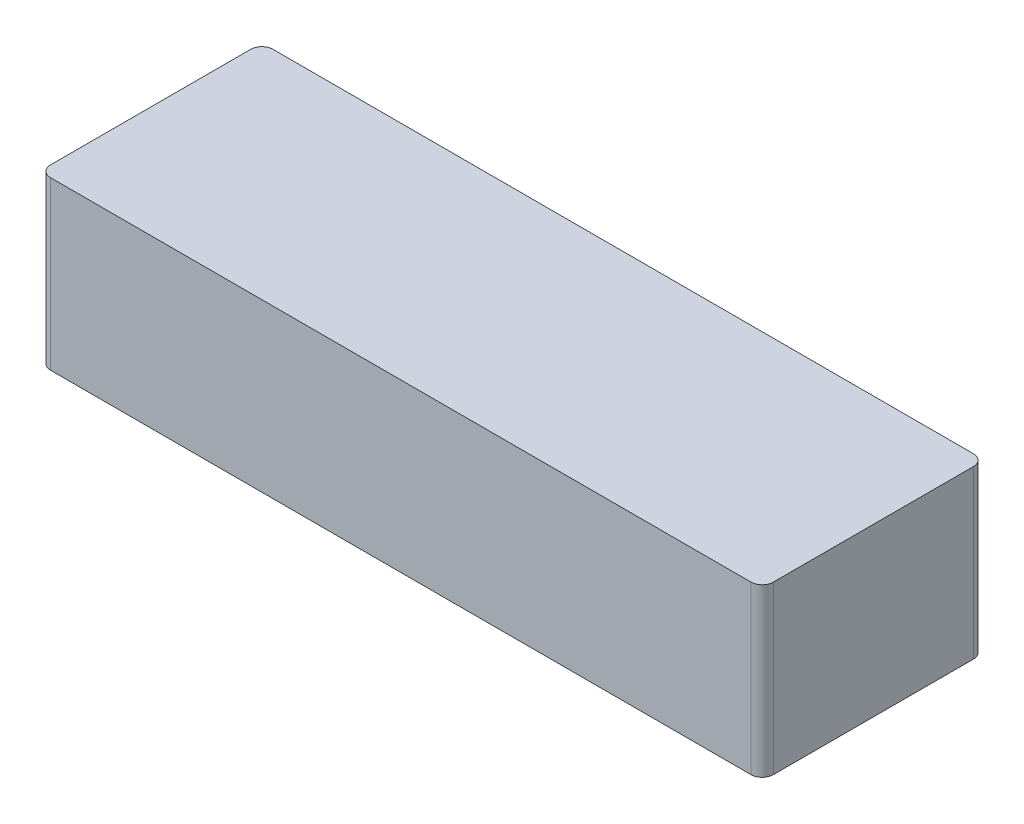
ISO-10303-21;
HEADER;
FILE_DESCRIPTION(('STEP AP214'),'2;1');
FILE_NAME('part.step','',(''),(''),'','','');
FILE_SCHEMA(('AUTOMOTIVE_DESIGN { 1 0 10303 214 1 1 1 1 }'));
ENDSEC;
DATA;
#1=APPLICATION_CONTEXT('core data for automotive mechanical design processes');
#2=APPLICATION_PROTOCOL_DEFINITION('international standard','automotive_design',2000,#1);
#3=PRODUCT_CONTEXT('',#1,'mechanical');
#4=PRODUCT('Part','Part','',(#3));
#5=PRODUCT_RELATED_PRODUCT_CATEGORY('part','',(#4));
#6=PRODUCT_DEFINITION_FORMATION('','',#4);
#7=PRODUCT_DEFINITION_CONTEXT('part definition',#1,'design');
#8=PRODUCT_DEFINITION('design','',#6,#7);
#9=PRODUCT_DEFINITION_SHAPE('','',#8);
#10=(LENGTH_UNIT() NAMED_UNIT(*) SI_UNIT(.MILLI.,.METRE.));
#11=(NAMED_UNIT(*) PLANE_ANGLE_UNIT() SI_UNIT($,.RADIAN.));
#12=(NAMED_UNIT(*) SI_UNIT($,.STERADIAN.) SOLID_ANGLE_UNIT());
#13=UNCERTAINTY_MEASURE_WITH_UNIT(LENGTH_MEASURE(1.E-05),#10,'distance_accuracy_value','');
#14=(GEOMETRIC_REPRESENTATION_CONTEXT(3) GLOBAL_UNCERTAINTY_ASSIGNED_CONTEXT((#13)) GLOBAL_UNIT_ASSIGNED_CONTEXT((#10,
#11,#12)) REPRESENTATION_CONTEXT('',''));
#15=CARTESIAN_POINT('',(0.,0.,0.));
#16=DIRECTION('',(0.,0.,1.));
#17=DIRECTION('',(1.,0.,0.));
#18=AXIS2_PLACEMENT_3D('',#15,#16,#17);
#19=CARTESIAN_POINT('',(64.9999999999999,-15.,40.));
#20=DIRECTION('',(-1.,0.,0.));
#21=DIRECTION('',(0.,0.,1.));
#22=AXIS2_PLACEMENT_3D('',#19,#20,#21);
#23=PLANE('',#22);
#24=DIRECTION('',(0.,0.,-1.));
#25=VECTOR('',#24,1.);
#26=CARTESIAN_POINT('',(64.9999999999999,-15.,40.));
#27=LINE('',#26,#25);
#28=CARTESIAN_POINT('',(64.9999999999999,-15.,38.));
#29=VERTEX_POINT('',#28);
#30=CARTESIAN_POINT('',(64.9999999999999,-15.,2.));
#31=VERTEX_POINT('',#30);
#32=EDGE_CURVE('E179',#29,#31,#27,.T.);
#33=ORIENTED_EDGE('',*,*,#32,.T.);
#34=DIRECTION('',(0.,1.,0.));
#35=VECTOR('',#34,1.);
#36=CARTESIAN_POINT('',(64.9999999999999,15.,2.));
#37=LINE('',#36,#35);
#38=CARTESIAN_POINT('',(64.9999999999999,15.,2.));
#39=VERTEX_POINT('',#38);
#40=EDGE_CURVE('E125',#31,#39,#37,.T.);
#41=ORIENTED_EDGE('',*,*,#40,.T.);
#42=DIRECTION('',(0.,0.,-1.));
#43=VECTOR('',#42,1.);
#44=CARTESIAN_POINT('',(64.9999999999999,15.,40.));
#45=LINE('',#44,#43);
#46=CARTESIAN_POINT('',(64.9999999999999,15.,38.));
#47=VERTEX_POINT('',#46);
#48=EDGE_CURVE('E116',#47,#39,#45,.T.);
#49=ORIENTED_EDGE('',*,*,#48,.F.);
#50=DIRECTION('',(0.,1.,0.));
#51=VECTOR('',#50,1.);
#52=CARTESIAN_POINT('',(64.9999999999999,-15.,38.));
#53=LINE('',#52,#51);
#54=EDGE_CURVE('E130',#47,#29,#53,.F.);
#55=ORIENTED_EDGE('',*,*,#54,.T.);
#56=EDGE_LOOP('',(#33,#41,#49,#55));
#57=FACE_BOUND('',#56,.T.);
#58=ADVANCED_FACE('F45',(#57),#23,.F.);
#59=CARTESIAN_POINT('',(-65.0000000000001,15.,40.));
#60=DIRECTION('',(0.,-1.,0.));
#61=DIRECTION('',(0.,0.,-1.));
#62=AXIS2_PLACEMENT_3D('',#59,#60,#61);
#63=PLANE('',#62);
#64=ORIENTED_EDGE('',*,*,#48,.T.);
#65=CARTESIAN_POINT('',(62.9999999999999,15.,2.));
#66=DIRECTION('',(0.,-1.,0.));
#67=DIRECTION('',(0.,0.,-1.));
#68=AXIS2_PLACEMENT_3D('',#65,#66,#67);
#69=CIRCLE('',#68,2.);
#70=CARTESIAN_POINT('',(62.9999999999999,15.,0.));
#71=VERTEX_POINT('',#70);
#72=EDGE_CURVE('E149',#39,#71,#69,.F.);
#73=ORIENTED_EDGE('',*,*,#72,.T.);
#74=DIRECTION('',(-1.,0.,0.));
#75=VECTOR('',#74,1.);
#76=CARTESIAN_POINT('',(-65.0000000000001,15.,0.));
#77=LINE('',#76,#75);
#78=CARTESIAN_POINT('',(-63.0000000000001,15.,0.));
#79=VERTEX_POINT('',#78);
#80=EDGE_CURVE('E188',#71,#79,#77,.T.);
#81=ORIENTED_EDGE('',*,*,#80,.T.);
#82=CARTESIAN_POINT('',(-63.0000000000001,15.,2.));
#83=DIRECTION('',(0.,-1.,0.));
#84=DIRECTION('',(0.,0.,-1.));
#85=AXIS2_PLACEMENT_3D('',#82,#83,#84);
#86=CIRCLE('',#85,2.);
#87=CARTESIAN_POINT('',(-65.0000000000001,15.,2.));
#88=VERTEX_POINT('',#87);
#89=EDGE_CURVE('E146',#79,#88,#86,.F.);
#90=ORIENTED_EDGE('',*,*,#89,.T.);
#91=DIRECTION('',(0.,0.,-1.));
#92=VECTOR('',#91,1.);
#93=CARTESIAN_POINT('',(-65.0000000000001,15.,40.));
#94=LINE('',#93,#92);
#95=CARTESIAN_POINT('',(-65.0000000000001,15.,38.));
#96=VERTEX_POINT('',#95);
#97=EDGE_CURVE('E134',#96,#88,#94,.T.);
#98=ORIENTED_EDGE('',*,*,#97,.F.);
#99=CARTESIAN_POINT('',(-63.0000000000001,15.,38.));
#100=DIRECTION('',(0.,-1.,0.));
#101=DIRECTION('',(0.,0.,-1.));
#102=AXIS2_PLACEMENT_3D('',#99,#100,#101);
#103=CIRCLE('',#102,2.);
#104=CARTESIAN_POINT('',(-63.0000000000001,15.,40.));
#105=VERTEX_POINT('',#104);
#106=EDGE_CURVE('E124',#96,#105,#103,.F.);
#107=ORIENTED_EDGE('',*,*,#106,.T.);
#108=DIRECTION('',(-1.,0.,0.));
#109=VECTOR('',#108,1.);
#110=CARTESIAN_POINT('',(-65.0000000000001,15.,40.));
#111=LINE('',#110,#109);
#112=CARTESIAN_POINT('',(62.9999999999999,15.,40.));
#113=VERTEX_POINT('',#112);
#114=EDGE_CURVE('E118',#113,#105,#111,.T.);
#115=ORIENTED_EDGE('',*,*,#114,.F.);
#116=CARTESIAN_POINT('',(62.9999999999999,15.,38.));
#117=DIRECTION('',(0.,-1.,0.));
#118=DIRECTION('',(0.,0.,-1.));
#119=AXIS2_PLACEMENT_3D('',#116,#117,#118);
#120=CIRCLE('',#119,2.);
#121=EDGE_CURVE('E113',#113,#47,#120,.F.);
#122=ORIENTED_EDGE('',*,*,#121,.T.);
#123=EDGE_LOOP('',(#64,#73,#81,#90,#98,#107,#115,#122));
#124=FACE_BOUND('',#123,.T.);
#125=ADVANCED_FACE('F115',(#124),#63,.F.);
#126=CARTESIAN_POINT('',(-65.0000000000001,-15.,40.));
#127=DIRECTION('',(1.,0.,0.));
#128=DIRECTION('',(0.,0.,-1.));
#129=AXIS2_PLACEMENT_3D('',#126,#127,#128);
#130=PLANE('',#129);
#131=ORIENTED_EDGE('',*,*,#97,.T.);
#132=DIRECTION('',(0.,-1.,0.));
#133=VECTOR('',#132,1.);
#134=CARTESIAN_POINT('',(-65.0000000000001,-15.,2.));
#135=LINE('',#134,#133);
#136=CARTESIAN_POINT('',(-65.0000000000001,-15.,2.));
#137=VERTEX_POINT('',#136);
#138=EDGE_CURVE('E170',#88,#137,#135,.T.);
#139=ORIENTED_EDGE('',*,*,#138,.T.);
#140=DIRECTION('',(0.,0.,-1.));
#141=VECTOR('',#140,1.);
#142=CARTESIAN_POINT('',(-65.0000000000001,-15.,40.));
#143=LINE('',#142,#141);
#144=CARTESIAN_POINT('',(-65.0000000000001,-15.,38.));
#145=VERTEX_POINT('',#144);
#146=EDGE_CURVE('E183',#145,#137,#143,.T.);
#147=ORIENTED_EDGE('',*,*,#146,.F.);
#148=DIRECTION('',(0.,-1.,0.));
#149=VECTOR('',#148,1.);
#150=CARTESIAN_POINT('',(-65.0000000000001,-15.,38.));
#151=LINE('',#150,#149);
#152=EDGE_CURVE('E167',#145,#96,#151,.F.);
#153=ORIENTED_EDGE('',*,*,#152,.T.);
#154=EDGE_LOOP('',(#131,#139,#147,#153));
#155=FACE_BOUND('',#154,.T.);
#156=ADVANCED_FACE('F200',(#155),#130,.F.);
#157=CARTESIAN_POINT('',(-65.0000000000001,-15.,40.));
#158=DIRECTION('',(0.,1.,0.));
#159=DIRECTION('',(0.,0.,1.));
#160=AXIS2_PLACEMENT_3D('',#157,#158,#159);
#161=PLANE('',#160);
#162=DIRECTION('',(1.,0.,0.));
#163=VECTOR('',#162,1.);
#164=CARTESIAN_POINT('',(-65.0000000000001,-15.,0.));
#165=LINE('',#164,#163);
#166=CARTESIAN_POINT('',(-63.0000000000001,-15.,0.));
#167=VERTEX_POINT('',#166);
#168=CARTESIAN_POINT('',(62.9999999999999,-15.,0.));
#169=VERTEX_POINT('',#168);
#170=EDGE_CURVE('E185',#167,#169,#165,.T.);
#171=ORIENTED_EDGE('',*,*,#170,.T.);
#172=CARTESIAN_POINT('',(62.9999999999999,-15.,2.));
#173=DIRECTION('',(0.,1.,0.));
#174=DIRECTION('',(0.,0.,1.));
#175=AXIS2_PLACEMENT_3D('',#172,#173,#174);
#176=CIRCLE('',#175,2.);
#177=EDGE_CURVE('E164',#169,#31,#176,.F.);
#178=ORIENTED_EDGE('',*,*,#177,.T.);
#179=ORIENTED_EDGE('',*,*,#32,.F.);
#180=CARTESIAN_POINT('',(62.9999999999999,-15.,38.));
#181=DIRECTION('',(0.,1.,0.));
#182=DIRECTION('',(0.,0.,1.));
#183=AXIS2_PLACEMENT_3D('',#180,#181,#182);
#184=CIRCLE('',#183,2.);
#185=CARTESIAN_POINT('',(62.9999999999999,-15.,40.));
#186=VERTEX_POINT('',#185);
#187=EDGE_CURVE('E137',#29,#186,#184,.F.);
#188=ORIENTED_EDGE('',*,*,#187,.T.);
#189=DIRECTION('',(1.,0.,0.));
#190=VECTOR('',#189,1.);
#191=CARTESIAN_POINT('',(-65.0000000000001,-15.,40.));
#192=LINE('',#191,#190);
#193=CARTESIAN_POINT('',(-63.0000000000001,-15.,40.));
#194=VERTEX_POINT('',#193);
#195=EDGE_CURVE('E177',#194,#186,#192,.T.);
#196=ORIENTED_EDGE('',*,*,#195,.F.);
#197=CARTESIAN_POINT('',(-63.0000000000001,-15.,38.));
#198=DIRECTION('',(0.,1.,0.));
#199=DIRECTION('',(0.,0.,1.));
#200=AXIS2_PLACEMENT_3D('',#197,#198,#199);
#201=CIRCLE('',#200,2.);
#202=EDGE_CURVE('E69',#194,#145,#201,.F.);
#203=ORIENTED_EDGE('',*,*,#202,.T.);
#204=ORIENTED_EDGE('',*,*,#146,.T.);
#205=CARTESIAN_POINT('',(-63.0000000000001,-15.,2.));
#206=DIRECTION('',(0.,1.,0.));
#207=DIRECTION('',(0.,0.,1.));
#208=AXIS2_PLACEMENT_3D('',#205,#206,#207);
#209=CIRCLE('',#208,2.);
#210=EDGE_CURVE('E61',#137,#167,#209,.F.);
#211=ORIENTED_EDGE('',*,*,#210,.T.);
#212=EDGE_LOOP('',(#171,#178,#179,#188,#196,#203,#204,#211));
#213=FACE_BOUND('',#212,.T.);
#214=ADVANCED_FACE('F213',(#213),#161,.F.);
#215=CARTESIAN_POINT('',(0.,0.,40.));
#216=DIRECTION('',(0.,0.,-1.));
#217=DIRECTION('',(-1.,0.,0.));
#218=AXIS2_PLACEMENT_3D('',#215,#216,#217);
#219=PLANE('',#218);
#220=ORIENTED_EDGE('',*,*,#114,.T.);
#221=DIRECTION('',(0.,-1.,0.));
#222=VECTOR('',#221,1.);
#223=CARTESIAN_POINT('',(-63.0000000000001,0.,40.));
#224=LINE('',#223,#222);
#225=EDGE_CURVE('E11',#105,#194,#224,.T.);
#226=ORIENTED_EDGE('',*,*,#225,.T.);
#227=ORIENTED_EDGE('',*,*,#195,.T.);
#228=DIRECTION('',(0.,1.,0.));
#229=VECTOR('',#228,1.);
#230=CARTESIAN_POINT('',(62.9999999999999,0.,40.));
#231=LINE('',#230,#229);
#232=EDGE_CURVE('E54',#186,#113,#231,.T.);
#233=ORIENTED_EDGE('',*,*,#232,.T.);
#234=EDGE_LOOP('',(#220,#226,#227,#233));
#235=FACE_BOUND('',#234,.T.);
#236=ADVANCED_FACE('F175',(#235),#219,.F.);
#237=CARTESIAN_POINT('',(0.,0.,0.));
#238=DIRECTION('',(0.,0.,-1.));
#239=DIRECTION('',(-1.,0.,0.));
#240=AXIS2_PLACEMENT_3D('',#237,#238,#239);
#241=PLANE('',#240);
#242=ORIENTED_EDGE('',*,*,#80,.F.);
#243=DIRECTION('',(0.,1.,0.));
#244=VECTOR('',#243,1.);
#245=CARTESIAN_POINT('',(62.9999999999999,-15.,0.));
#246=LINE('',#245,#244);
#247=EDGE_CURVE('E155',#71,#169,#246,.F.);
#248=ORIENTED_EDGE('',*,*,#247,.T.);
#249=ORIENTED_EDGE('',*,*,#170,.F.);
#250=DIRECTION('',(0.,-1.,0.));
#251=VECTOR('',#250,1.);
#252=CARTESIAN_POINT('',(-63.0000000000001,15.,0.));
#253=LINE('',#252,#251);
#254=EDGE_CURVE('E152',#167,#79,#253,.F.);
#255=ORIENTED_EDGE('',*,*,#254,.T.);
#256=EDGE_LOOP('',(#242,#248,#249,#255));
#257=FACE_BOUND('',#256,.T.);
#258=ADVANCED_FACE('F208',(#257),#241,.T.);
#259=CARTESIAN_POINT('',(62.9999999999999,-15.,2.));
#260=DIRECTION('',(0.,-1.,0.));
#261=DIRECTION('',(0.,0.,-1.));
#262=AXIS2_PLACEMENT_3D('',#259,#260,#261);
#263=CYLINDRICAL_SURFACE('',#262,2.);
#264=ORIENTED_EDGE('',*,*,#177,.F.);
#265=ORIENTED_EDGE('',*,*,#247,.F.);
#266=ORIENTED_EDGE('',*,*,#72,.F.);
#267=ORIENTED_EDGE('',*,*,#40,.F.);
#268=EDGE_LOOP('',(#264,#265,#266,#267));
#269=FACE_BOUND('',#268,.T.);
#270=ADVANCED_FACE('F212',(#269),#263,.T.);
#271=CARTESIAN_POINT('',(-63.0000000000001,-15.,2.));
#272=DIRECTION('',(0.,1.,0.));
#273=DIRECTION('',(0.,0.,1.));
#274=AXIS2_PLACEMENT_3D('',#271,#272,#273);
#275=CYLINDRICAL_SURFACE('',#274,2.);
#276=ORIENTED_EDGE('',*,*,#89,.F.);
#277=ORIENTED_EDGE('',*,*,#254,.F.);
#278=ORIENTED_EDGE('',*,*,#210,.F.);
#279=ORIENTED_EDGE('',*,*,#138,.F.);
#280=EDGE_LOOP('',(#276,#277,#278,#279));
#281=FACE_BOUND('',#280,.T.);
#282=ADVANCED_FACE('F204',(#281),#275,.T.);
#283=CARTESIAN_POINT('',(-63.0000000000001,0.,38.));
#284=DIRECTION('',(0.,-1.,0.));
#285=DIRECTION('',(0.,0.,-1.));
#286=AXIS2_PLACEMENT_3D('',#283,#284,#285);
#287=CYLINDRICAL_SURFACE('',#286,2.);
#288=ORIENTED_EDGE('',*,*,#106,.F.);
#289=ORIENTED_EDGE('',*,*,#152,.F.);
#290=ORIENTED_EDGE('',*,*,#202,.F.);
#291=ORIENTED_EDGE('',*,*,#225,.F.);
#292=EDGE_LOOP('',(#288,#289,#290,#291));
#293=FACE_BOUND('',#292,.T.);
#294=ADVANCED_FACE('F215',(#293),#287,.T.);
#295=CARTESIAN_POINT('',(62.9999999999999,0.,38.));
#296=DIRECTION('',(0.,1.,0.));
#297=DIRECTION('',(0.,0.,1.));
#298=AXIS2_PLACEMENT_3D('',#295,#296,#297);
#299=CYLINDRICAL_SURFACE('',#298,2.);
#300=ORIENTED_EDGE('',*,*,#187,.F.);
#301=ORIENTED_EDGE('',*,*,#54,.F.);
#302=ORIENTED_EDGE('',*,*,#121,.F.);
#303=ORIENTED_EDGE('',*,*,#232,.F.);
#304=EDGE_LOOP('',(#300,#301,#302,#303));
#305=FACE_BOUND('',#304,.T.);
#306=ADVANCED_FACE('F47',(#305),#299,.T.);
#307=CLOSED_SHELL('',(#58,#125,#156,#214,#236,#258,#270,#282,#294,#306));
#308=MANIFOLD_SOLID_BREP('B2',#307);
#309=ADVANCED_BREP_SHAPE_REPRESENTATION('',(#18,#308),#14);
#310=SHAPE_DEFINITION_REPRESENTATION(#9,#309);
ENDSEC;
END-ISO-10303-21;
